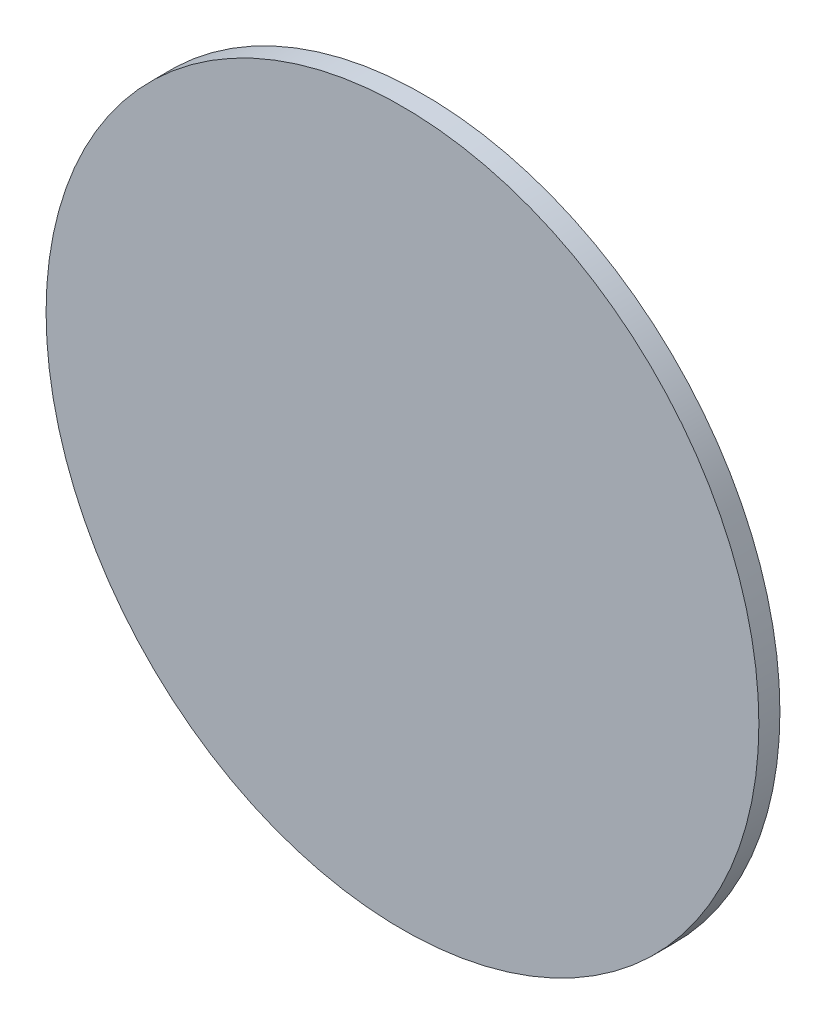
ISO-10303-21;
HEADER;
FILE_DESCRIPTION(('STEP AP214'),'2;1');
FILE_NAME('part.step','',(''),(''),'','','');
FILE_SCHEMA(('AUTOMOTIVE_DESIGN { 1 0 10303 214 1 1 1 1 }'));
ENDSEC;
DATA;
#1=APPLICATION_CONTEXT('core data for automotive mechanical design processes');
#2=APPLICATION_PROTOCOL_DEFINITION('international standard','automotive_design',2000,#1);
#3=PRODUCT_CONTEXT('',#1,'mechanical');
#4=PRODUCT('Part','Part','',(#3));
#5=PRODUCT_RELATED_PRODUCT_CATEGORY('part','',(#4));
#6=PRODUCT_DEFINITION_FORMATION('','',#4);
#7=PRODUCT_DEFINITION_CONTEXT('part definition',#1,'design');
#8=PRODUCT_DEFINITION('design','',#6,#7);
#9=PRODUCT_DEFINITION_SHAPE('','',#8);
#10=(LENGTH_UNIT() NAMED_UNIT(*) SI_UNIT(.MILLI.,.METRE.));
#11=(NAMED_UNIT(*) PLANE_ANGLE_UNIT() SI_UNIT($,.RADIAN.));
#12=(NAMED_UNIT(*) SI_UNIT($,.STERADIAN.) SOLID_ANGLE_UNIT());
#13=UNCERTAINTY_MEASURE_WITH_UNIT(LENGTH_MEASURE(1.E-05),#10,'distance_accuracy_value','');
#14=(GEOMETRIC_REPRESENTATION_CONTEXT(3) GLOBAL_UNCERTAINTY_ASSIGNED_CONTEXT((#13)) GLOBAL_UNIT_ASSIGNED_CONTEXT((#10,
#11,#12)) REPRESENTATION_CONTEXT('',''));
#15=CARTESIAN_POINT('',(0.,0.,0.));
#16=DIRECTION('',(0.,0.,1.));
#17=DIRECTION('',(1.,0.,0.));
#18=AXIS2_PLACEMENT_3D('',#15,#16,#17);
#19=CARTESIAN_POINT('',(0.,0.,3.));
#20=DIRECTION('',(0.,0.,-1.));
#21=DIRECTION('',(-1.,0.,0.));
#22=AXIS2_PLACEMENT_3D('',#19,#20,#21);
#23=CYLINDRICAL_SURFACE('',#22,50.8);
#24=CARTESIAN_POINT('',(0.,0.,3.));
#25=DIRECTION('',(0.,0.,1.));
#26=DIRECTION('',(1.,0.,0.));
#27=AXIS2_PLACEMENT_3D('',#24,#25,#26);
#28=CIRCLE('',#27,50.8);
#29=CARTESIAN_POINT('',(50.8,0.,3.));
#30=VERTEX_POINT('',#29);
#31=EDGE_CURVE('E10',#30,#30,#28,.T.);
#32=ORIENTED_EDGE('',*,*,#31,.F.);
#33=EDGE_LOOP('',(#32));
#34=FACE_BOUND('',#33,.T.);
#35=CARTESIAN_POINT('',(0.,0.,0.));
#36=DIRECTION('',(0.,0.,1.));
#37=DIRECTION('',(1.,0.,0.));
#38=AXIS2_PLACEMENT_3D('',#35,#36,#37);
#39=CIRCLE('',#38,50.8);
#40=CARTESIAN_POINT('',(50.8,0.,0.));
#41=VERTEX_POINT('',#40);
#42=EDGE_CURVE('E40',#41,#41,#39,.T.);
#43=ORIENTED_EDGE('',*,*,#42,.T.);
#44=EDGE_LOOP('',(#43));
#45=FACE_BOUND('',#44,.T.);
#46=ADVANCED_FACE('F37',(#34,#45),#23,.T.);
#47=CARTESIAN_POINT('',(0.,0.,3.));
#48=DIRECTION('',(0.,0.,1.));
#49=DIRECTION('',(1.,0.,0.));
#50=AXIS2_PLACEMENT_3D('',#47,#48,#49);
#51=PLANE('',#50);
#52=ORIENTED_EDGE('',*,*,#31,.T.);
#53=EDGE_LOOP('',(#52));
#54=FACE_BOUND('',#53,.T.);
#55=ADVANCED_FACE('F54',(#54),#51,.T.);
#56=CARTESIAN_POINT('',(0.,0.,0.));
#57=DIRECTION('',(0.,0.,1.));
#58=DIRECTION('',(1.,0.,0.));
#59=AXIS2_PLACEMENT_3D('',#56,#57,#58);
#60=PLANE('',#59);
#61=ORIENTED_EDGE('',*,*,#42,.F.);
#62=EDGE_LOOP('',(#61));
#63=FACE_BOUND('',#62,.T.);
#64=ADVANCED_FACE('F52',(#63),#60,.F.);
#65=CLOSED_SHELL('',(#46,#55,#64));
#66=MANIFOLD_SOLID_BREP('B2',#65);
#67=ADVANCED_BREP_SHAPE_REPRESENTATION('',(#18,#66),#14);
#68=SHAPE_DEFINITION_REPRESENTATION(#9,#67);
ENDSEC;
END-ISO-10303-21;
